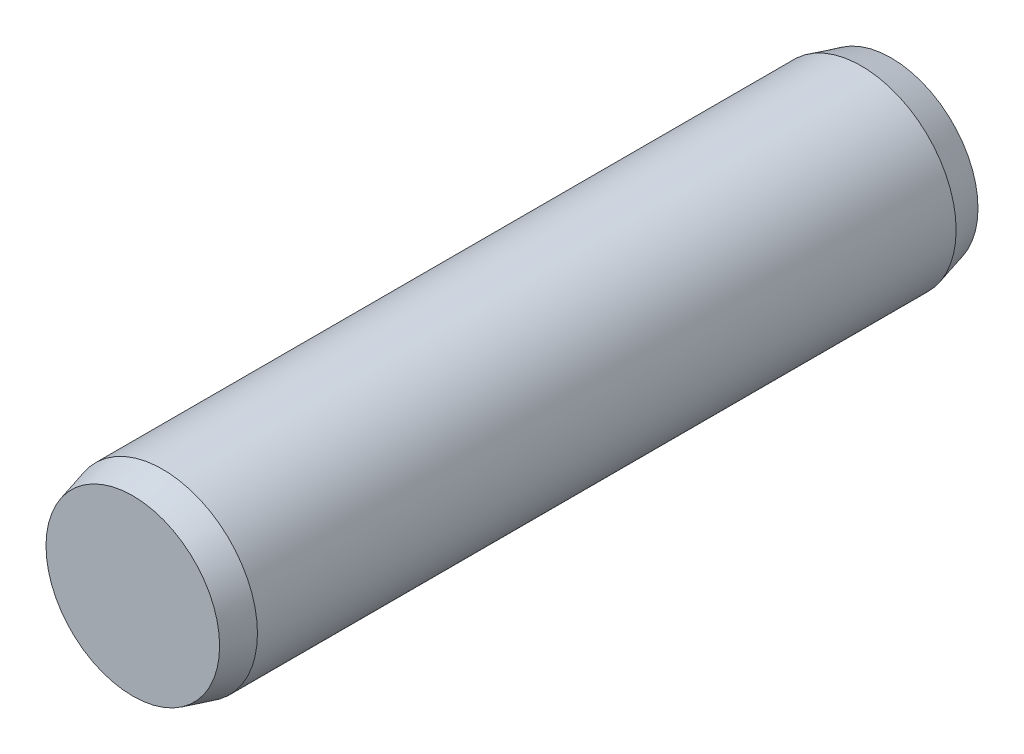
ISO-10303-21;
HEADER;
FILE_DESCRIPTION(('STEP AP214'),'2;1');
FILE_NAME('part.step','',(''),(''),'','','');
FILE_SCHEMA(('AUTOMOTIVE_DESIGN { 1 0 10303 214 1 1 1 1 }'));
ENDSEC;
DATA;
#1=APPLICATION_CONTEXT('core data for automotive mechanical design processes');
#2=APPLICATION_PROTOCOL_DEFINITION('international standard','automotive_design',2000,#1);
#3=PRODUCT_CONTEXT('',#1,'mechanical');
#4=PRODUCT('Part','Part','',(#3));
#5=PRODUCT_RELATED_PRODUCT_CATEGORY('part','',(#4));
#6=PRODUCT_DEFINITION_FORMATION('','',#4);
#7=PRODUCT_DEFINITION_CONTEXT('part definition',#1,'design');
#8=PRODUCT_DEFINITION('design','',#6,#7);
#9=PRODUCT_DEFINITION_SHAPE('','',#8);
#10=(LENGTH_UNIT() NAMED_UNIT(*) SI_UNIT(.MILLI.,.METRE.));
#11=(NAMED_UNIT(*) PLANE_ANGLE_UNIT() SI_UNIT($,.RADIAN.));
#12=(NAMED_UNIT(*) SI_UNIT($,.STERADIAN.) SOLID_ANGLE_UNIT());
#13=UNCERTAINTY_MEASURE_WITH_UNIT(LENGTH_MEASURE(1.E-05),#10,'distance_accuracy_value','');
#14=(GEOMETRIC_REPRESENTATION_CONTEXT(3) GLOBAL_UNCERTAINTY_ASSIGNED_CONTEXT((#13)) GLOBAL_UNIT_ASSIGNED_CONTEXT((#10,
#11,#12)) REPRESENTATION_CONTEXT('',''));
#15=CARTESIAN_POINT('',(0.,0.,0.));
#16=DIRECTION('',(0.,0.,1.));
#17=DIRECTION('',(1.,0.,0.));
#18=AXIS2_PLACEMENT_3D('',#15,#16,#17);
#19=CARTESIAN_POINT('',(0.,0.,7.37));
#20=DIRECTION('',(0.,0.,-1.));
#21=DIRECTION('',(-1.,0.,0.));
#22=AXIS2_PLACEMENT_3D('',#19,#20,#21);
#23=CONICAL_SURFACE('',#22,2.,0.26179938779915);
#24=CARTESIAN_POINT('',(0.,0.,8.));
#25=DIRECTION('',(0.,0.,1.));
#26=DIRECTION('',(1.,0.,0.));
#27=AXIS2_PLACEMENT_3D('',#24,#25,#26);
#28=CIRCLE('',#27,1.83119200876839);
#29=CARTESIAN_POINT('',(1.83119200876839,0.,8.));
#30=VERTEX_POINT('',#29);
#31=EDGE_CURVE('E46',#30,#30,#28,.T.);
#32=ORIENTED_EDGE('',*,*,#31,.F.);
#33=EDGE_LOOP('',(#32));
#34=FACE_BOUND('',#33,.T.);
#35=CARTESIAN_POINT('',(0.,0.,7.37));
#36=DIRECTION('',(0.,0.,1.));
#37=DIRECTION('',(1.,0.,0.));
#38=AXIS2_PLACEMENT_3D('',#35,#36,#37);
#39=CIRCLE('',#38,2.);
#40=CARTESIAN_POINT('',(2.,0.,7.37));
#41=VERTEX_POINT('',#40);
#42=EDGE_CURVE('E10',#41,#41,#39,.T.);
#43=ORIENTED_EDGE('',*,*,#42,.T.);
#44=EDGE_LOOP('',(#43));
#45=FACE_BOUND('',#44,.T.);
#46=ADVANCED_FACE('F32',(#34,#45),#23,.T.);
#47=CARTESIAN_POINT('',(0.,0.,8.));
#48=DIRECTION('',(0.,0.,1.));
#49=DIRECTION('',(1.,0.,0.));
#50=AXIS2_PLACEMENT_3D('',#47,#48,#49);
#51=CYLINDRICAL_SURFACE('',#50,2.);
#52=ORIENTED_EDGE('',*,*,#42,.F.);
#53=EDGE_LOOP('',(#52));
#54=FACE_BOUND('',#53,.T.);
#55=CARTESIAN_POINT('',(0.,0.,-7.37));
#56=DIRECTION('',(0.,0.,1.));
#57=DIRECTION('',(1.,0.,0.));
#58=AXIS2_PLACEMENT_3D('',#55,#56,#57);
#59=CIRCLE('',#58,2.);
#60=CARTESIAN_POINT('',(2.,0.,-7.37));
#61=VERTEX_POINT('',#60);
#62=EDGE_CURVE('E38',#61,#61,#59,.T.);
#63=ORIENTED_EDGE('',*,*,#62,.T.);
#64=EDGE_LOOP('',(#63));
#65=FACE_BOUND('',#64,.T.);
#66=ADVANCED_FACE('F55',(#54,#65),#51,.T.);
#67=CARTESIAN_POINT('',(0.,0.,-8.));
#68=DIRECTION('',(0.,0.,1.));
#69=DIRECTION('',(1.,0.,0.));
#70=AXIS2_PLACEMENT_3D('',#67,#68,#69);
#71=CONICAL_SURFACE('',#70,1.83119200876839,0.26179938779915);
#72=ORIENTED_EDGE('',*,*,#62,.F.);
#73=EDGE_LOOP('',(#72));
#74=FACE_BOUND('',#73,.T.);
#75=CARTESIAN_POINT('',(0.,0.,-8.));
#76=DIRECTION('',(0.,0.,1.));
#77=DIRECTION('',(1.,0.,0.));
#78=AXIS2_PLACEMENT_3D('',#75,#76,#77);
#79=CIRCLE('',#78,1.83119200876839);
#80=CARTESIAN_POINT('',(1.83119200876839,0.,-8.));
#81=VERTEX_POINT('',#80);
#82=EDGE_CURVE('E42',#81,#81,#79,.T.);
#83=ORIENTED_EDGE('',*,*,#82,.T.);
#84=EDGE_LOOP('',(#83));
#85=FACE_BOUND('',#84,.T.);
#86=ADVANCED_FACE('F59',(#74,#85),#71,.T.);
#87=CARTESIAN_POINT('',(0.,1.83119200876839,-8.));
#88=DIRECTION('',(0.,0.,1.));
#89=DIRECTION('',(1.,0.,0.));
#90=AXIS2_PLACEMENT_3D('',#87,#88,#89);
#91=PLANE('',#90);
#92=ORIENTED_EDGE('',*,*,#82,.F.);
#93=EDGE_LOOP('',(#92));
#94=FACE_BOUND('',#93,.T.);
#95=ADVANCED_FACE('F64',(#94),#91,.F.);
#96=CARTESIAN_POINT('',(0.,0.,8.));
#97=DIRECTION('',(0.,0.,-1.));
#98=DIRECTION('',(-1.,0.,0.));
#99=AXIS2_PLACEMENT_3D('',#96,#97,#98);
#100=PLANE('',#99);
#101=ORIENTED_EDGE('',*,*,#31,.T.);
#102=EDGE_LOOP('',(#101));
#103=FACE_BOUND('',#102,.T.);
#104=ADVANCED_FACE('F52',(#103),#100,.F.);
#105=CLOSED_SHELL('',(#46,#66,#86,#95,#104));
#106=MANIFOLD_SOLID_BREP('B2',#105);
#107=ADVANCED_BREP_SHAPE_REPRESENTATION('',(#18,#106),#14);
#108=SHAPE_DEFINITION_REPRESENTATION(#9,#107);
ENDSEC;
END-ISO-10303-21;
